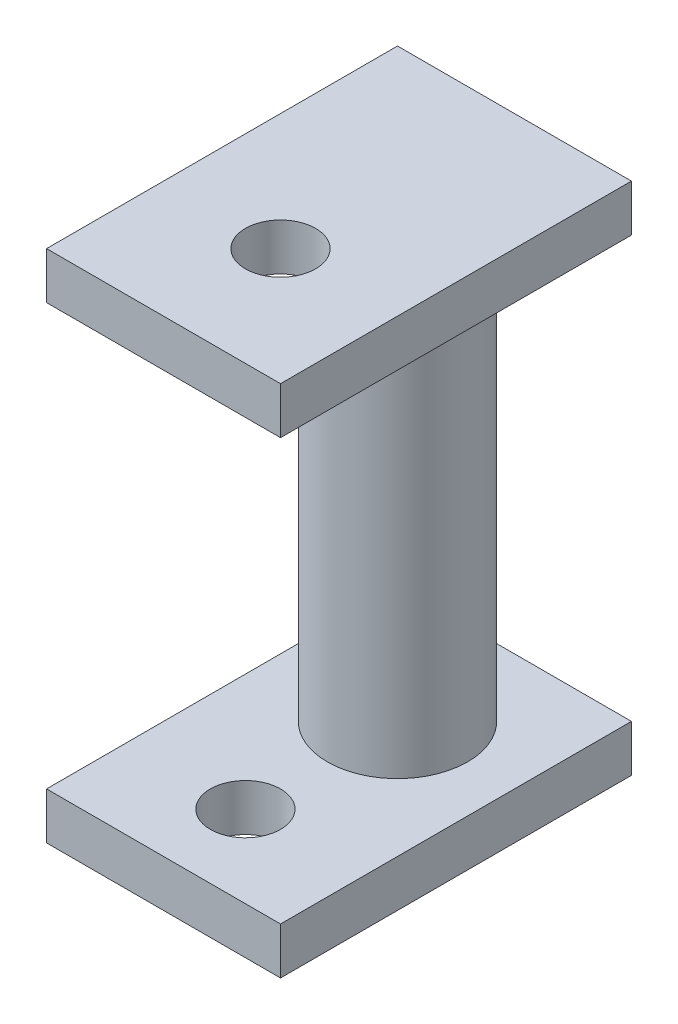
ISO-10303-21;
HEADER;
FILE_DESCRIPTION(('STEP AP214'),'2;1');
FILE_NAME('part.step','',(''),(''),'','','');
FILE_SCHEMA(('AUTOMOTIVE_DESIGN { 1 0 10303 214 1 1 1 1 }'));
ENDSEC;
DATA;
#1=APPLICATION_CONTEXT('core data for automotive mechanical design processes');
#2=APPLICATION_PROTOCOL_DEFINITION('international standard','automotive_design',2000,#1);
#3=PRODUCT_CONTEXT('',#1,'mechanical');
#4=PRODUCT('Part','Part','',(#3));
#5=PRODUCT_RELATED_PRODUCT_CATEGORY('part','',(#4));
#6=PRODUCT_DEFINITION_FORMATION('','',#4);
#7=PRODUCT_DEFINITION_CONTEXT('part definition',#1,'design');
#8=PRODUCT_DEFINITION('design','',#6,#7);
#9=PRODUCT_DEFINITION_SHAPE('','',#8);
#10=(LENGTH_UNIT() NAMED_UNIT(*) SI_UNIT(.MILLI.,.METRE.));
#11=(NAMED_UNIT(*) PLANE_ANGLE_UNIT() SI_UNIT($,.RADIAN.));
#12=(NAMED_UNIT(*) SI_UNIT($,.STERADIAN.) SOLID_ANGLE_UNIT());
#13=UNCERTAINTY_MEASURE_WITH_UNIT(LENGTH_MEASURE(1.E-05),#10,'distance_accuracy_value','');
#14=(GEOMETRIC_REPRESENTATION_CONTEXT(3) GLOBAL_UNCERTAINTY_ASSIGNED_CONTEXT((#13)) GLOBAL_UNIT_ASSIGNED_CONTEXT((#10,
#11,#12)) REPRESENTATION_CONTEXT('',''));
#15=CARTESIAN_POINT('',(0.,0.,0.));
#16=DIRECTION('',(0.,0.,1.));
#17=DIRECTION('',(1.,0.,0.));
#18=AXIS2_PLACEMENT_3D('',#15,#16,#17);
#19=CARTESIAN_POINT('',(0.,22.,0.));
#20=DIRECTION('',(0.,-1.,0.));
#21=DIRECTION('',(0.,0.,-1.));
#22=AXIS2_PLACEMENT_3D('',#19,#20,#21);
#23=CYLINDRICAL_SURFACE('',#22,3.);
#24=CARTESIAN_POINT('',(0.,2.,0.));
#25=DIRECTION('',(0.,1.,0.));
#26=DIRECTION('',(0.,0.,1.));
#27=AXIS2_PLACEMENT_3D('',#24,#25,#26);
#28=CIRCLE('',#27,3.);
#29=CARTESIAN_POINT('',(0.,2.,3.));
#30=VERTEX_POINT('',#29);
#31=EDGE_CURVE('E156',#30,#30,#28,.T.);
#32=ORIENTED_EDGE('',*,*,#31,.T.);
#33=EDGE_LOOP('',(#32));
#34=FACE_BOUND('',#33,.T.);
#35=CARTESIAN_POINT('',(0.,20.,0.));
#36=DIRECTION('',(0.,1.,0.));
#37=DIRECTION('',(0.,0.,1.));
#38=AXIS2_PLACEMENT_3D('',#35,#36,#37);
#39=CIRCLE('',#38,3.);
#40=CARTESIAN_POINT('',(0.,20.,3.));
#41=VERTEX_POINT('',#40);
#42=EDGE_CURVE('E11',#41,#41,#39,.T.);
#43=ORIENTED_EDGE('',*,*,#42,.F.);
#44=EDGE_LOOP('',(#43));
#45=FACE_BOUND('',#44,.T.);
#46=ADVANCED_FACE('F43',(#34,#45),#23,.T.);
#47=CARTESIAN_POINT('',(-5.,2.,0.));
#48=DIRECTION('',(-1.,0.,0.));
#49=DIRECTION('',(0.,0.,1.));
#50=AXIS2_PLACEMENT_3D('',#47,#48,#49);
#51=PLANE('',#50);
#52=DIRECTION('',(0.,0.,-1.));
#53=VECTOR('',#52,1.);
#54=CARTESIAN_POINT('',(-5.,0.,0.));
#55=LINE('',#54,#53);
#56=CARTESIAN_POINT('',(-5.,0.,10.));
#57=VERTEX_POINT('',#56);
#58=CARTESIAN_POINT('',(-5.,0.,-5.));
#59=VERTEX_POINT('',#58);
#60=EDGE_CURVE('E179',#57,#59,#55,.T.);
#61=ORIENTED_EDGE('',*,*,#60,.F.);
#62=DIRECTION('',(0.,-1.,0.));
#63=VECTOR('',#62,1.);
#64=CARTESIAN_POINT('',(-5.,2.,10.));
#65=LINE('',#64,#63);
#66=CARTESIAN_POINT('',(-5.,2.,10.));
#67=VERTEX_POINT('',#66);
#68=EDGE_CURVE('E52',#67,#57,#65,.T.);
#69=ORIENTED_EDGE('',*,*,#68,.F.);
#70=DIRECTION('',(0.,0.,-1.));
#71=VECTOR('',#70,1.);
#72=CARTESIAN_POINT('',(-5.,2.,0.));
#73=LINE('',#72,#71);
#74=CARTESIAN_POINT('',(-5.,2.,-5.));
#75=VERTEX_POINT('',#74);
#76=EDGE_CURVE('E167',#67,#75,#73,.T.);
#77=ORIENTED_EDGE('',*,*,#76,.T.);
#78=DIRECTION('',(0.,-1.,0.));
#79=VECTOR('',#78,1.);
#80=CARTESIAN_POINT('',(-5.,2.,-5.));
#81=LINE('',#80,#79);
#82=EDGE_CURVE('E60',#75,#59,#81,.T.);
#83=ORIENTED_EDGE('',*,*,#82,.T.);
#84=EDGE_LOOP('',(#61,#69,#77,#83));
#85=FACE_BOUND('',#84,.T.);
#86=ADVANCED_FACE('F199',(#85),#51,.T.);
#87=CARTESIAN_POINT('',(0.,2.,10.));
#88=DIRECTION('',(0.,0.,-1.));
#89=DIRECTION('',(-1.,0.,0.));
#90=AXIS2_PLACEMENT_3D('',#87,#88,#89);
#91=PLANE('',#90);
#92=DIRECTION('',(1.,0.,0.));
#93=VECTOR('',#92,1.);
#94=CARTESIAN_POINT('',(0.,0.,10.));
#95=LINE('',#94,#93);
#96=CARTESIAN_POINT('',(5.,0.,10.));
#97=VERTEX_POINT('',#96);
#98=EDGE_CURVE('E181',#57,#97,#95,.T.);
#99=ORIENTED_EDGE('',*,*,#98,.T.);
#100=DIRECTION('',(0.,-1.,0.));
#101=VECTOR('',#100,1.);
#102=CARTESIAN_POINT('',(5.,2.,10.));
#103=LINE('',#102,#101);
#104=CARTESIAN_POINT('',(5.,2.,10.));
#105=VERTEX_POINT('',#104);
#106=EDGE_CURVE('E190',#105,#97,#103,.T.);
#107=ORIENTED_EDGE('',*,*,#106,.F.);
#108=DIRECTION('',(1.,0.,0.));
#109=VECTOR('',#108,1.);
#110=CARTESIAN_POINT('',(0.,2.,10.));
#111=LINE('',#110,#109);
#112=EDGE_CURVE('E170',#67,#105,#111,.T.);
#113=ORIENTED_EDGE('',*,*,#112,.F.);
#114=ORIENTED_EDGE('',*,*,#68,.T.);
#115=EDGE_LOOP('',(#99,#107,#113,#114));
#116=FACE_BOUND('',#115,.T.);
#117=ADVANCED_FACE('F194',(#116),#91,.F.);
#118=CARTESIAN_POINT('',(5.,2.,0.));
#119=DIRECTION('',(-1.,0.,0.));
#120=DIRECTION('',(0.,0.,1.));
#121=AXIS2_PLACEMENT_3D('',#118,#119,#120);
#122=PLANE('',#121);
#123=DIRECTION('',(0.,0.,-1.));
#124=VECTOR('',#123,1.);
#125=CARTESIAN_POINT('',(5.,0.,0.));
#126=LINE('',#125,#124);
#127=CARTESIAN_POINT('',(5.,0.,-5.));
#128=VERTEX_POINT('',#127);
#129=EDGE_CURVE('E184',#97,#128,#126,.T.);
#130=ORIENTED_EDGE('',*,*,#129,.T.);
#131=DIRECTION('',(0.,-1.,0.));
#132=VECTOR('',#131,1.);
#133=CARTESIAN_POINT('',(5.,2.,-5.));
#134=LINE('',#133,#132);
#135=CARTESIAN_POINT('',(5.,2.,-5.));
#136=VERTEX_POINT('',#135);
#137=EDGE_CURVE('E76',#136,#128,#134,.T.);
#138=ORIENTED_EDGE('',*,*,#137,.F.);
#139=DIRECTION('',(0.,0.,-1.));
#140=VECTOR('',#139,1.);
#141=CARTESIAN_POINT('',(5.,2.,0.));
#142=LINE('',#141,#140);
#143=EDGE_CURVE('E173',#105,#136,#142,.T.);
#144=ORIENTED_EDGE('',*,*,#143,.F.);
#145=ORIENTED_EDGE('',*,*,#106,.T.);
#146=EDGE_LOOP('',(#130,#138,#144,#145));
#147=FACE_BOUND('',#146,.T.);
#148=ADVANCED_FACE('F204',(#147),#122,.F.);
#149=CARTESIAN_POINT('',(0.,2.,6.5));
#150=DIRECTION('',(0.,-1.,0.));
#151=DIRECTION('',(0.,0.,-1.));
#152=AXIS2_PLACEMENT_3D('',#149,#150,#151);
#153=CYLINDRICAL_SURFACE('',#152,1.5);
#154=CARTESIAN_POINT('',(0.,2.,6.5));
#155=DIRECTION('',(0.,1.,0.));
#156=DIRECTION('',(0.,0.,1.));
#157=AXIS2_PLACEMENT_3D('',#154,#155,#156);
#158=CIRCLE('',#157,1.5);
#159=CARTESIAN_POINT('',(0.,2.,8.));
#160=VERTEX_POINT('',#159);
#161=EDGE_CURVE('E164',#160,#160,#158,.T.);
#162=ORIENTED_EDGE('',*,*,#161,.T.);
#163=EDGE_LOOP('',(#162));
#164=FACE_BOUND('',#163,.T.);
#165=CARTESIAN_POINT('',(0.,0.,6.5));
#166=DIRECTION('',(0.,1.,0.));
#167=DIRECTION('',(0.,0.,1.));
#168=AXIS2_PLACEMENT_3D('',#165,#166,#167);
#169=CIRCLE('',#168,1.5);
#170=CARTESIAN_POINT('',(0.,0.,8.));
#171=VERTEX_POINT('',#170);
#172=EDGE_CURVE('E163',#171,#171,#169,.T.);
#173=ORIENTED_EDGE('',*,*,#172,.F.);
#174=EDGE_LOOP('',(#173));
#175=FACE_BOUND('',#174,.T.);
#176=ADVANCED_FACE('F45',(#164,#175),#153,.F.);
#177=CARTESIAN_POINT('',(0.,2.,-5.));
#178=DIRECTION('',(0.,0.,-1.));
#179=DIRECTION('',(-1.,0.,0.));
#180=AXIS2_PLACEMENT_3D('',#177,#178,#179);
#181=PLANE('',#180);
#182=DIRECTION('',(1.,0.,0.));
#183=VECTOR('',#182,1.);
#184=CARTESIAN_POINT('',(0.,0.,-5.));
#185=LINE('',#184,#183);
#186=EDGE_CURVE('E168',#59,#128,#185,.T.);
#187=ORIENTED_EDGE('',*,*,#186,.F.);
#188=ORIENTED_EDGE('',*,*,#82,.F.);
#189=DIRECTION('',(1.,0.,0.));
#190=VECTOR('',#189,1.);
#191=CARTESIAN_POINT('',(0.,2.,-5.));
#192=LINE('',#191,#190);
#193=EDGE_CURVE('E175',#75,#136,#192,.T.);
#194=ORIENTED_EDGE('',*,*,#193,.T.);
#195=ORIENTED_EDGE('',*,*,#137,.T.);
#196=EDGE_LOOP('',(#187,#188,#194,#195));
#197=FACE_BOUND('',#196,.T.);
#198=ADVANCED_FACE('F213',(#197),#181,.T.);
#199=CARTESIAN_POINT('',(0.,2.,0.));
#200=DIRECTION('',(0.,1.,0.));
#201=DIRECTION('',(0.,0.,1.));
#202=AXIS2_PLACEMENT_3D('',#199,#200,#201);
#203=PLANE('',#202);
#204=ORIENTED_EDGE('',*,*,#31,.F.);
#205=EDGE_LOOP('',(#204));
#206=FACE_BOUND('',#205,.T.);
#207=ORIENTED_EDGE('',*,*,#161,.F.);
#208=EDGE_LOOP('',(#207));
#209=FACE_BOUND('',#208,.T.);
#210=ORIENTED_EDGE('',*,*,#76,.F.);
#211=ORIENTED_EDGE('',*,*,#112,.T.);
#212=ORIENTED_EDGE('',*,*,#143,.T.);
#213=ORIENTED_EDGE('',*,*,#193,.F.);
#214=EDGE_LOOP('',(#210,#211,#212,#213));
#215=FACE_BOUND('',#214,.T.);
#216=ADVANCED_FACE('F216',(#206,#209,#215),#203,.T.);
#217=CARTESIAN_POINT('',(0.,0.,0.));
#218=DIRECTION('',(0.,1.,0.));
#219=DIRECTION('',(0.,0.,1.));
#220=AXIS2_PLACEMENT_3D('',#217,#218,#219);
#221=PLANE('',#220);
#222=ORIENTED_EDGE('',*,*,#172,.T.);
#223=EDGE_LOOP('',(#222));
#224=FACE_BOUND('',#223,.T.);
#225=ORIENTED_EDGE('',*,*,#60,.T.);
#226=ORIENTED_EDGE('',*,*,#186,.T.);
#227=ORIENTED_EDGE('',*,*,#129,.F.);
#228=ORIENTED_EDGE('',*,*,#98,.F.);
#229=EDGE_LOOP('',(#225,#226,#227,#228));
#230=FACE_BOUND('',#229,.T.);
#231=ADVANCED_FACE('F198',(#224,#230),#221,.F.);
#232=CARTESIAN_POINT('',(0.,20.,10.));
#233=DIRECTION('',(0.,0.,1.));
#234=DIRECTION('',(1.,0.,0.));
#235=AXIS2_PLACEMENT_3D('',#232,#233,#234);
#236=PLANE('',#235);
#237=DIRECTION('',(1.,0.,0.));
#238=VECTOR('',#237,1.);
#239=CARTESIAN_POINT('',(0.,22.,10.));
#240=LINE('',#239,#238);
#241=CARTESIAN_POINT('',(-5.,22.,10.));
#242=VERTEX_POINT('',#241);
#243=CARTESIAN_POINT('',(5.,22.,10.));
#244=VERTEX_POINT('',#243);
#245=EDGE_CURVE('E147',#242,#244,#240,.T.);
#246=ORIENTED_EDGE('',*,*,#245,.F.);
#247=DIRECTION('',(0.,1.,0.));
#248=VECTOR('',#247,1.);
#249=CARTESIAN_POINT('',(-5.,20.,10.));
#250=LINE('',#249,#248);
#251=CARTESIAN_POINT('',(-5.,20.,10.));
#252=VERTEX_POINT('',#251);
#253=EDGE_CURVE('E134',#252,#242,#250,.T.);
#254=ORIENTED_EDGE('',*,*,#253,.F.);
#255=DIRECTION('',(1.,0.,0.));
#256=VECTOR('',#255,1.);
#257=CARTESIAN_POINT('',(0.,20.,10.));
#258=LINE('',#257,#256);
#259=CARTESIAN_POINT('',(5.,20.,10.));
#260=VERTEX_POINT('',#259);
#261=EDGE_CURVE('E129',#252,#260,#258,.T.);
#262=ORIENTED_EDGE('',*,*,#261,.T.);
#263=DIRECTION('',(0.,1.,0.));
#264=VECTOR('',#263,1.);
#265=CARTESIAN_POINT('',(5.,20.,10.));
#266=LINE('',#265,#264);
#267=EDGE_CURVE('E112',#260,#244,#266,.T.);
#268=ORIENTED_EDGE('',*,*,#267,.T.);
#269=EDGE_LOOP('',(#246,#254,#262,#268));
#270=FACE_BOUND('',#269,.T.);
#271=ADVANCED_FACE('F133',(#270),#236,.T.);
#272=CARTESIAN_POINT('',(-5.,20.,0.));
#273=DIRECTION('',(1.,0.,0.));
#274=DIRECTION('',(0.,0.,-1.));
#275=AXIS2_PLACEMENT_3D('',#272,#273,#274);
#276=PLANE('',#275);
#277=DIRECTION('',(0.,0.,-1.));
#278=VECTOR('',#277,1.);
#279=CARTESIAN_POINT('',(-5.,22.,0.));
#280=LINE('',#279,#278);
#281=CARTESIAN_POINT('',(-5.,22.,-5.));
#282=VERTEX_POINT('',#281);
#283=EDGE_CURVE('E139',#242,#282,#280,.T.);
#284=ORIENTED_EDGE('',*,*,#283,.T.);
#285=DIRECTION('',(0.,1.,0.));
#286=VECTOR('',#285,1.);
#287=CARTESIAN_POINT('',(-5.,20.,-5.));
#288=LINE('',#287,#286);
#289=CARTESIAN_POINT('',(-5.,20.,-5.));
#290=VERTEX_POINT('',#289);
#291=EDGE_CURVE('E157',#290,#282,#288,.T.);
#292=ORIENTED_EDGE('',*,*,#291,.F.);
#293=DIRECTION('',(0.,0.,-1.));
#294=VECTOR('',#293,1.);
#295=CARTESIAN_POINT('',(-5.,20.,0.));
#296=LINE('',#295,#294);
#297=EDGE_CURVE('E123',#252,#290,#296,.T.);
#298=ORIENTED_EDGE('',*,*,#297,.F.);
#299=ORIENTED_EDGE('',*,*,#253,.T.);
#300=EDGE_LOOP('',(#284,#292,#298,#299));
#301=FACE_BOUND('',#300,.T.);
#302=ADVANCED_FACE('F234',(#301),#276,.F.);
#303=CARTESIAN_POINT('',(0.,20.,-5.));
#304=DIRECTION('',(0.,0.,1.));
#305=DIRECTION('',(1.,0.,0.));
#306=AXIS2_PLACEMENT_3D('',#303,#304,#305);
#307=PLANE('',#306);
#308=DIRECTION('',(1.,0.,0.));
#309=VECTOR('',#308,1.);
#310=CARTESIAN_POINT('',(0.,22.,-5.));
#311=LINE('',#310,#309);
#312=CARTESIAN_POINT('',(5.,22.,-5.));
#313=VERTEX_POINT('',#312);
#314=EDGE_CURVE('E150',#282,#313,#311,.T.);
#315=ORIENTED_EDGE('',*,*,#314,.T.);
#316=DIRECTION('',(0.,1.,0.));
#317=VECTOR('',#316,1.);
#318=CARTESIAN_POINT('',(5.,20.,-5.));
#319=LINE('',#318,#317);
#320=CARTESIAN_POINT('',(5.,20.,-5.));
#321=VERTEX_POINT('',#320);
#322=EDGE_CURVE('E122',#321,#313,#319,.T.);
#323=ORIENTED_EDGE('',*,*,#322,.F.);
#324=DIRECTION('',(1.,0.,0.));
#325=VECTOR('',#324,1.);
#326=CARTESIAN_POINT('',(0.,20.,-5.));
#327=LINE('',#326,#325);
#328=EDGE_CURVE('E130',#290,#321,#327,.T.);
#329=ORIENTED_EDGE('',*,*,#328,.F.);
#330=ORIENTED_EDGE('',*,*,#291,.T.);
#331=EDGE_LOOP('',(#315,#323,#329,#330));
#332=FACE_BOUND('',#331,.T.);
#333=ADVANCED_FACE('F230',(#332),#307,.F.);
#334=CARTESIAN_POINT('',(0.,20.,5.));
#335=DIRECTION('',(0.,1.,0.));
#336=DIRECTION('',(0.,0.,1.));
#337=AXIS2_PLACEMENT_3D('',#334,#335,#336);
#338=CYLINDRICAL_SURFACE('',#337,1.5);
#339=CARTESIAN_POINT('',(0.,20.,5.));
#340=DIRECTION('',(0.,1.,0.));
#341=DIRECTION('',(0.,0.,1.));
#342=AXIS2_PLACEMENT_3D('',#339,#340,#341);
#343=CIRCLE('',#342,1.5);
#344=CARTESIAN_POINT('',(0.,20.,6.5));
#345=VERTEX_POINT('',#344);
#346=EDGE_CURVE('E136',#345,#345,#343,.T.);
#347=ORIENTED_EDGE('',*,*,#346,.F.);
#348=EDGE_LOOP('',(#347));
#349=FACE_BOUND('',#348,.T.);
#350=CARTESIAN_POINT('',(0.,22.,5.));
#351=DIRECTION('',(0.,1.,0.));
#352=DIRECTION('',(0.,0.,1.));
#353=AXIS2_PLACEMENT_3D('',#350,#351,#352);
#354=CIRCLE('',#353,1.5);
#355=CARTESIAN_POINT('',(0.,22.,6.5));
#356=VERTEX_POINT('',#355);
#357=EDGE_CURVE('E144',#356,#356,#354,.T.);
#358=ORIENTED_EDGE('',*,*,#357,.T.);
#359=EDGE_LOOP('',(#358));
#360=FACE_BOUND('',#359,.T.);
#361=ADVANCED_FACE('F227',(#349,#360),#338,.F.);
#362=CARTESIAN_POINT('',(5.,20.,0.));
#363=DIRECTION('',(1.,0.,0.));
#364=DIRECTION('',(0.,0.,-1.));
#365=AXIS2_PLACEMENT_3D('',#362,#363,#364);
#366=PLANE('',#365);
#367=DIRECTION('',(0.,0.,-1.));
#368=VECTOR('',#367,1.);
#369=CARTESIAN_POINT('',(5.,22.,0.));
#370=LINE('',#369,#368);
#371=EDGE_CURVE('E117',#244,#313,#370,.T.);
#372=ORIENTED_EDGE('',*,*,#371,.F.);
#373=ORIENTED_EDGE('',*,*,#267,.F.);
#374=DIRECTION('',(0.,0.,-1.));
#375=VECTOR('',#374,1.);
#376=CARTESIAN_POINT('',(5.,20.,0.));
#377=LINE('',#376,#375);
#378=EDGE_CURVE('E115',#260,#321,#377,.T.);
#379=ORIENTED_EDGE('',*,*,#378,.T.);
#380=ORIENTED_EDGE('',*,*,#322,.T.);
#381=EDGE_LOOP('',(#372,#373,#379,#380));
#382=FACE_BOUND('',#381,.T.);
#383=ADVANCED_FACE('F114',(#382),#366,.T.);
#384=CARTESIAN_POINT('',(0.,20.,0.));
#385=DIRECTION('',(0.,1.,0.));
#386=DIRECTION('',(0.,0.,1.));
#387=AXIS2_PLACEMENT_3D('',#384,#385,#386);
#388=PLANE('',#387);
#389=ORIENTED_EDGE('',*,*,#346,.T.);
#390=EDGE_LOOP('',(#389));
#391=FACE_BOUND('',#390,.T.);
#392=ORIENTED_EDGE('',*,*,#42,.T.);
#393=EDGE_LOOP('',(#392));
#394=FACE_BOUND('',#393,.T.);
#395=ORIENTED_EDGE('',*,*,#261,.F.);
#396=ORIENTED_EDGE('',*,*,#297,.T.);
#397=ORIENTED_EDGE('',*,*,#328,.T.);
#398=ORIENTED_EDGE('',*,*,#378,.F.);
#399=EDGE_LOOP('',(#395,#396,#397,#398));
#400=FACE_BOUND('',#399,.T.);
#401=ADVANCED_FACE('F127',(#391,#394,#400),#388,.F.);
#402=CARTESIAN_POINT('',(0.,22.,0.));
#403=DIRECTION('',(0.,1.,0.));
#404=DIRECTION('',(0.,0.,1.));
#405=AXIS2_PLACEMENT_3D('',#402,#403,#404);
#406=PLANE('',#405);
#407=ORIENTED_EDGE('',*,*,#357,.F.);
#408=EDGE_LOOP('',(#407));
#409=FACE_BOUND('',#408,.T.);
#410=ORIENTED_EDGE('',*,*,#245,.T.);
#411=ORIENTED_EDGE('',*,*,#371,.T.);
#412=ORIENTED_EDGE('',*,*,#314,.F.);
#413=ORIENTED_EDGE('',*,*,#283,.F.);
#414=EDGE_LOOP('',(#410,#411,#412,#413));
#415=FACE_BOUND('',#414,.T.);
#416=ADVANCED_FACE('F223',(#409,#415),#406,.T.);
#417=CLOSED_SHELL('',(#46,#86,#117,#148,#176,#198,#216,#231,#271,#302,#333,#361,#383,#401,#416));
#418=MANIFOLD_SOLID_BREP('B2',#417);
#419=ADVANCED_BREP_SHAPE_REPRESENTATION('',(#18,#418),#14);
#420=SHAPE_DEFINITION_REPRESENTATION(#9,#419);
ENDSEC;
END-ISO-10303-21;
